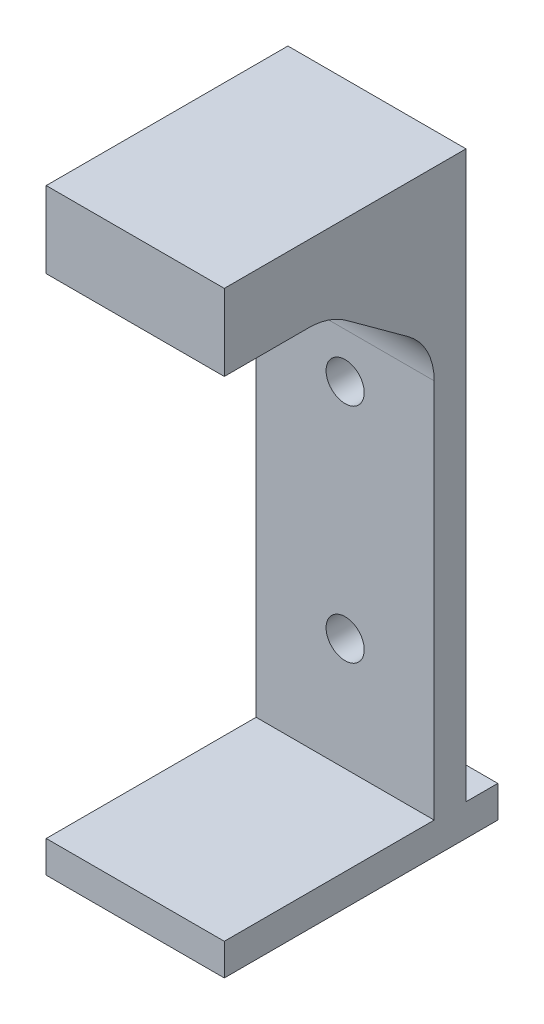
ISO-10303-21;
HEADER;
FILE_DESCRIPTION(('STEP AP214'),'2;1');
FILE_NAME('part.step','',(''),(''),'','','');
FILE_SCHEMA(('AUTOMOTIVE_DESIGN { 1 0 10303 214 1 1 1 1 }'));
ENDSEC;
DATA;
#1=APPLICATION_CONTEXT('core data for automotive mechanical design processes');
#2=APPLICATION_PROTOCOL_DEFINITION('international standard','automotive_design',2000,#1);
#3=PRODUCT_CONTEXT('',#1,'mechanical');
#4=PRODUCT('Part','Part','',(#3));
#5=PRODUCT_RELATED_PRODUCT_CATEGORY('part','',(#4));
#6=PRODUCT_DEFINITION_FORMATION('','',#4);
#7=PRODUCT_DEFINITION_CONTEXT('part definition',#1,'design');
#8=PRODUCT_DEFINITION('design','',#6,#7);
#9=PRODUCT_DEFINITION_SHAPE('','',#8);
#10=(LENGTH_UNIT() NAMED_UNIT(*) SI_UNIT(.MILLI.,.METRE.));
#11=(NAMED_UNIT(*) PLANE_ANGLE_UNIT() SI_UNIT($,.RADIAN.));
#12=(NAMED_UNIT(*) SI_UNIT($,.STERADIAN.) SOLID_ANGLE_UNIT());
#13=UNCERTAINTY_MEASURE_WITH_UNIT(LENGTH_MEASURE(1.E-05),#10,'distance_accuracy_value','');
#14=(GEOMETRIC_REPRESENTATION_CONTEXT(3) GLOBAL_UNCERTAINTY_ASSIGNED_CONTEXT((#13)) GLOBAL_UNIT_ASSIGNED_CONTEXT((#10,
#11,#12)) REPRESENTATION_CONTEXT('',''));
#15=CARTESIAN_POINT('',(0.,0.,0.));
#16=DIRECTION('',(0.,0.,1.));
#17=DIRECTION('',(1.,0.,0.));
#18=AXIS2_PLACEMENT_3D('',#15,#16,#17);
#19=CARTESIAN_POINT('',(0.,0.,2.5));
#20=DIRECTION('',(0.,0.,-1.));
#21=DIRECTION('',(-1.,0.,0.));
#22=AXIS2_PLACEMENT_3D('',#19,#20,#21);
#23=PLANE('',#22);
#24=CARTESIAN_POINT('',(7.,8.85,2.5));
#25=DIRECTION('',(0.,0.,1.));
#26=DIRECTION('',(1.,0.,0.));
#27=AXIS2_PLACEMENT_3D('',#24,#25,#26);
#28=CIRCLE('',#27,1.5);
#29=CARTESIAN_POINT('',(8.5,8.85,2.5));
#30=VERTEX_POINT('',#29);
#31=EDGE_CURVE('E235',#30,#30,#28,.T.);
#32=ORIENTED_EDGE('',*,*,#31,.F.);
#33=EDGE_LOOP('',(#32));
#34=FACE_BOUND('',#33,.T.);
#35=CARTESIAN_POINT('',(7.,26.35,2.5));
#36=DIRECTION('',(0.,0.,1.));
#37=DIRECTION('',(1.,0.,0.));
#38=AXIS2_PLACEMENT_3D('',#35,#36,#37);
#39=CIRCLE('',#38,1.5);
#40=CARTESIAN_POINT('',(8.5,26.35,2.5));
#41=VERTEX_POINT('',#40);
#42=EDGE_CURVE('E243',#41,#41,#39,.T.);
#43=ORIENTED_EDGE('',*,*,#42,.F.);
#44=EDGE_LOOP('',(#43));
#45=FACE_BOUND('',#44,.T.);
#46=DIRECTION('',(0.,1.,0.));
#47=VECTOR('',#46,1.);
#48=CARTESIAN_POINT('',(14.,0.,2.5));
#49=LINE('',#48,#47);
#50=CARTESIAN_POINT('',(14.,0.,2.5));
#51=VERTEX_POINT('',#50);
#52=CARTESIAN_POINT('',(14.,29.9038770414839,2.5));
#53=VERTEX_POINT('',#52);
#54=EDGE_CURVE('E258',#51,#53,#49,.T.);
#55=ORIENTED_EDGE('',*,*,#54,.T.);
#56=DIRECTION('',(1.,0.,0.));
#57=VECTOR('',#56,1.);
#58=CARTESIAN_POINT('',(0.,29.9038770414839,2.5));
#59=LINE('',#58,#57);
#60=CARTESIAN_POINT('',(0.,29.9038770414839,2.5));
#61=VERTEX_POINT('',#60);
#62=EDGE_CURVE('E59',#53,#61,#59,.F.);
#63=ORIENTED_EDGE('',*,*,#62,.T.);
#64=DIRECTION('',(0.,-1.,0.));
#65=VECTOR('',#64,1.);
#66=CARTESIAN_POINT('',(0.,0.,2.5));
#67=LINE('',#66,#65);
#68=CARTESIAN_POINT('',(0.,0.,2.5));
#69=VERTEX_POINT('',#68);
#70=EDGE_CURVE('E251',#61,#69,#67,.T.);
#71=ORIENTED_EDGE('',*,*,#70,.T.);
#72=DIRECTION('',(1.,0.,0.));
#73=VECTOR('',#72,1.);
#74=CARTESIAN_POINT('',(0.,0.,2.5));
#75=LINE('',#74,#73);
#76=EDGE_CURVE('E254',#69,#51,#75,.T.);
#77=ORIENTED_EDGE('',*,*,#76,.T.);
#78=EDGE_LOOP('',(#55,#63,#71,#77));
#79=FACE_BOUND('',#78,.T.);
#80=ADVANCED_FACE('F43',(#34,#45,#79),#23,.F.);
#81=CARTESIAN_POINT('',(0.,0.,0.));
#82=DIRECTION('',(0.,0.,-1.));
#83=DIRECTION('',(-1.,0.,0.));
#84=AXIS2_PLACEMENT_3D('',#81,#82,#83);
#85=PLANE('',#84);
#86=CARTESIAN_POINT('',(7.,26.35,0.));
#87=DIRECTION('',(0.,0.,1.));
#88=DIRECTION('',(1.,0.,0.));
#89=AXIS2_PLACEMENT_3D('',#86,#87,#88);
#90=CIRCLE('',#89,1.5);
#91=CARTESIAN_POINT('',(8.5,26.35,0.));
#92=VERTEX_POINT('',#91);
#93=EDGE_CURVE('E239',#92,#92,#90,.T.);
#94=ORIENTED_EDGE('',*,*,#93,.T.);
#95=EDGE_LOOP('',(#94));
#96=FACE_BOUND('',#95,.T.);
#97=DIRECTION('',(0.,-1.,0.));
#98=VECTOR('',#97,1.);
#99=CARTESIAN_POINT('',(0.,0.,0.));
#100=LINE('',#99,#98);
#101=CARTESIAN_POINT('',(0.,44.45,0.));
#102=VERTEX_POINT('',#101);
#103=CARTESIAN_POINT('',(0.,0.,0.));
#104=VERTEX_POINT('',#103);
#105=EDGE_CURVE('E247',#102,#104,#100,.T.);
#106=ORIENTED_EDGE('',*,*,#105,.F.);
#107=DIRECTION('',(-1.,0.,0.));
#108=VECTOR('',#107,1.);
#109=CARTESIAN_POINT('',(0.,44.45,0.));
#110=LINE('',#109,#108);
#111=CARTESIAN_POINT('',(14.,44.45,0.));
#112=VERTEX_POINT('',#111);
#113=EDGE_CURVE('E150',#112,#102,#110,.T.);
#114=ORIENTED_EDGE('',*,*,#113,.F.);
#115=DIRECTION('',(0.,1.,0.));
#116=VECTOR('',#115,1.);
#117=CARTESIAN_POINT('',(14.,0.,0.));
#118=LINE('',#117,#116);
#119=CARTESIAN_POINT('',(14.,0.,0.));
#120=VERTEX_POINT('',#119);
#121=EDGE_CURVE('E145',#120,#112,#118,.T.);
#122=ORIENTED_EDGE('',*,*,#121,.F.);
#123=DIRECTION('',(1.,0.,0.));
#124=VECTOR('',#123,1.);
#125=CARTESIAN_POINT('',(0.,0.,0.));
#126=LINE('',#125,#124);
#127=EDGE_CURVE('E265',#104,#120,#126,.T.);
#128=ORIENTED_EDGE('',*,*,#127,.F.);
#129=EDGE_LOOP('',(#106,#114,#122,#128));
#130=FACE_BOUND('',#129,.T.);
#131=CARTESIAN_POINT('',(7.,8.85,0.));
#132=DIRECTION('',(0.,0.,1.));
#133=DIRECTION('',(1.,0.,0.));
#134=AXIS2_PLACEMENT_3D('',#131,#132,#133);
#135=CIRCLE('',#134,1.5);
#136=CARTESIAN_POINT('',(8.5,8.85,0.));
#137=VERTEX_POINT('',#136);
#138=EDGE_CURVE('E230',#137,#137,#135,.T.);
#139=ORIENTED_EDGE('',*,*,#138,.T.);
#140=EDGE_LOOP('',(#139));
#141=FACE_BOUND('',#140,.T.);
#142=ADVANCED_FACE('F315',(#96,#130,#141),#85,.T.);
#143=CARTESIAN_POINT('',(0.,0.,2.5));
#144=DIRECTION('',(1.,0.,0.));
#145=DIRECTION('',(0.,0.,-1.));
#146=AXIS2_PLACEMENT_3D('',#143,#144,#145);
#147=PLANE('',#146);
#148=ORIENTED_EDGE('',*,*,#70,.F.);
#149=CARTESIAN_POINT('',(0.,29.9038770414839,7.5));
#150=DIRECTION('',(1.,0.,0.));
#151=DIRECTION('',(0.,0.,-1.));
#152=AXIS2_PLACEMENT_3D('',#149,#150,#151);
#153=CIRCLE('',#152,5.);
#154=CARTESIAN_POINT('',(0.,33.9475574629998,4.55914151162477));
#155=VERTEX_POINT('',#154);
#156=EDGE_CURVE('E11',#61,#155,#153,.T.);
#157=ORIENTED_EDGE('',*,*,#156,.T.);
#158=DIRECTION('',(0.,0.588171697675046,0.808736084303189));
#159=VECTOR('',#158,1.);
#160=CARTESIAN_POINT('',(0.,38.45,10.75));
#161=LINE('',#160,#159);
#162=CARTESIAN_POINT('',(0.,37.4936804215159,9.43506057958442));
#163=VERTEX_POINT('',#162);
#164=EDGE_CURVE('E186',#155,#163,#161,.T.);
#165=ORIENTED_EDGE('',*,*,#164,.T.);
#166=CARTESIAN_POINT('',(0.,33.45,12.3759190679597));
#167=DIRECTION('',(1.,0.,0.));
#168=DIRECTION('',(0.,0.,-1.));
#169=AXIS2_PLACEMENT_3D('',#166,#167,#168);
#170=CIRCLE('',#169,5.);
#171=CARTESIAN_POINT('',(0.,38.45,12.3759190679597));
#172=VERTEX_POINT('',#171);
#173=EDGE_CURVE('E285',#163,#172,#170,.T.);
#174=ORIENTED_EDGE('',*,*,#173,.T.);
#175=DIRECTION('',(0.,0.,-1.));
#176=VECTOR('',#175,1.);
#177=CARTESIAN_POINT('',(0.,38.45,34.2315462117278));
#178=LINE('',#177,#176);
#179=CARTESIAN_POINT('',(0.,38.45,19.));
#180=VERTEX_POINT('',#179);
#181=EDGE_CURVE('E182',#180,#172,#178,.T.);
#182=ORIENTED_EDGE('',*,*,#181,.F.);
#183=DIRECTION('',(0.,-1.,0.));
#184=VECTOR('',#183,1.);
#185=CARTESIAN_POINT('',(0.,44.45,19.));
#186=LINE('',#185,#184);
#187=CARTESIAN_POINT('',(0.,44.45,19.));
#188=VERTEX_POINT('',#187);
#189=EDGE_CURVE('E161',#188,#180,#186,.T.);
#190=ORIENTED_EDGE('',*,*,#189,.F.);
#191=DIRECTION('',(0.,0.,1.));
#192=VECTOR('',#191,1.);
#193=CARTESIAN_POINT('',(0.,44.45,0.));
#194=LINE('',#193,#192);
#195=EDGE_CURVE('E151',#102,#188,#194,.T.);
#196=ORIENTED_EDGE('',*,*,#195,.F.);
#197=ORIENTED_EDGE('',*,*,#105,.T.);
#198=DIRECTION('',(0.,0.,1.));
#199=VECTOR('',#198,1.);
#200=CARTESIAN_POINT('',(0.,0.,-2.5));
#201=LINE('',#200,#199);
#202=CARTESIAN_POINT('',(0.,0.,-2.5));
#203=VERTEX_POINT('',#202);
#204=EDGE_CURVE('E227',#203,#104,#201,.T.);
#205=ORIENTED_EDGE('',*,*,#204,.F.);
#206=DIRECTION('',(0.,-1.,0.));
#207=VECTOR('',#206,1.);
#208=CARTESIAN_POINT('',(0.,0.,-2.5));
#209=LINE('',#208,#207);
#210=CARTESIAN_POINT('',(0.,-2.5,-2.5));
#211=VERTEX_POINT('',#210);
#212=EDGE_CURVE('E215',#203,#211,#209,.T.);
#213=ORIENTED_EDGE('',*,*,#212,.T.);
#214=DIRECTION('',(0.,0.,1.));
#215=VECTOR('',#214,1.);
#216=CARTESIAN_POINT('',(0.,-2.5,-16.7214626533279));
#217=LINE('',#216,#215);
#218=CARTESIAN_POINT('',(0.,-2.5,19.));
#219=VERTEX_POINT('',#218);
#220=EDGE_CURVE('E173',#211,#219,#217,.T.);
#221=ORIENTED_EDGE('',*,*,#220,.T.);
#222=DIRECTION('',(0.,-1.,0.));
#223=VECTOR('',#222,1.);
#224=CARTESIAN_POINT('',(0.,0.,19.));
#225=LINE('',#224,#223);
#226=CARTESIAN_POINT('',(0.,0.,19.));
#227=VERTEX_POINT('',#226);
#228=EDGE_CURVE('E204',#227,#219,#225,.T.);
#229=ORIENTED_EDGE('',*,*,#228,.F.);
#230=EDGE_CURVE('E231',#69,#227,#201,.T.);
#231=ORIENTED_EDGE('',*,*,#230,.F.);
#232=EDGE_LOOP('',(#148,#157,#165,#174,#182,#190,#196,#197,#205,#213,#221,#229,#231));
#233=FACE_BOUND('',#232,.T.);
#234=ADVANCED_FACE('F301',(#233),#147,.F.);
#235=CARTESIAN_POINT('',(14.,0.,2.5));
#236=DIRECTION('',(-1.,0.,0.));
#237=DIRECTION('',(0.,0.,1.));
#238=AXIS2_PLACEMENT_3D('',#235,#236,#237);
#239=PLANE('',#238);
#240=DIRECTION('',(0.,0.,-1.));
#241=VECTOR('',#240,1.);
#242=CARTESIAN_POINT('',(14.,38.45,34.2315462117278));
#243=LINE('',#242,#241);
#244=CARTESIAN_POINT('',(14.,38.45,19.));
#245=VERTEX_POINT('',#244);
#246=CARTESIAN_POINT('',(14.,38.45,12.3759190679597));
#247=VERTEX_POINT('',#246);
#248=EDGE_CURVE('E162',#245,#247,#243,.T.);
#249=ORIENTED_EDGE('',*,*,#248,.T.);
#250=CARTESIAN_POINT('',(14.,33.45,12.3759190679597));
#251=DIRECTION('',(-1.,0.,0.));
#252=DIRECTION('',(0.,0.,1.));
#253=AXIS2_PLACEMENT_3D('',#250,#251,#252);
#254=CIRCLE('',#253,5.);
#255=CARTESIAN_POINT('',(14.,37.4936804215159,9.43506057958442));
#256=VERTEX_POINT('',#255);
#257=EDGE_CURVE('E282',#247,#256,#254,.T.);
#258=ORIENTED_EDGE('',*,*,#257,.T.);
#259=DIRECTION('',(0.,-0.588171697675046,-0.808736084303189));
#260=VECTOR('',#259,1.);
#261=CARTESIAN_POINT('',(14.,38.45,10.75));
#262=LINE('',#261,#260);
#263=CARTESIAN_POINT('',(14.,33.9475574629998,4.55914151162477));
#264=VERTEX_POINT('',#263);
#265=EDGE_CURVE('E177',#256,#264,#262,.T.);
#266=ORIENTED_EDGE('',*,*,#265,.T.);
#267=CARTESIAN_POINT('',(14.,29.9038770414839,7.5));
#268=DIRECTION('',(-1.,0.,0.));
#269=DIRECTION('',(0.,0.,1.));
#270=AXIS2_PLACEMENT_3D('',#267,#268,#269);
#271=CIRCLE('',#270,5.);
#272=EDGE_CURVE('E52',#264,#53,#271,.T.);
#273=ORIENTED_EDGE('',*,*,#272,.T.);
#274=ORIENTED_EDGE('',*,*,#54,.F.);
#275=DIRECTION('',(0.,0.,1.));
#276=VECTOR('',#275,1.);
#277=CARTESIAN_POINT('',(14.,0.,-2.5));
#278=LINE('',#277,#276);
#279=CARTESIAN_POINT('',(14.,0.,19.));
#280=VERTEX_POINT('',#279);
#281=EDGE_CURVE('E226',#51,#280,#278,.T.);
#282=ORIENTED_EDGE('',*,*,#281,.T.);
#283=DIRECTION('',(0.,1.,0.));
#284=VECTOR('',#283,1.);
#285=CARTESIAN_POINT('',(14.,0.,19.));
#286=LINE('',#285,#284);
#287=CARTESIAN_POINT('',(14.,-2.5,19.));
#288=VERTEX_POINT('',#287);
#289=EDGE_CURVE('E207',#288,#280,#286,.T.);
#290=ORIENTED_EDGE('',*,*,#289,.F.);
#291=DIRECTION('',(0.,0.,1.));
#292=VECTOR('',#291,1.);
#293=CARTESIAN_POINT('',(14.,-2.5,-16.7214626533279));
#294=LINE('',#293,#292);
#295=CARTESIAN_POINT('',(14.,-2.5,-2.5));
#296=VERTEX_POINT('',#295);
#297=EDGE_CURVE('E189',#296,#288,#294,.T.);
#298=ORIENTED_EDGE('',*,*,#297,.F.);
#299=DIRECTION('',(0.,1.,0.));
#300=VECTOR('',#299,1.);
#301=CARTESIAN_POINT('',(14.,0.,-2.5));
#302=LINE('',#301,#300);
#303=CARTESIAN_POINT('',(14.,0.,-2.5));
#304=VERTEX_POINT('',#303);
#305=EDGE_CURVE('E218',#296,#304,#302,.T.);
#306=ORIENTED_EDGE('',*,*,#305,.T.);
#307=EDGE_CURVE('E232',#304,#120,#278,.T.);
#308=ORIENTED_EDGE('',*,*,#307,.T.);
#309=ORIENTED_EDGE('',*,*,#121,.T.);
#310=DIRECTION('',(0.,0.,-1.));
#311=VECTOR('',#310,1.);
#312=CARTESIAN_POINT('',(14.,44.45,0.));
#313=LINE('',#312,#311);
#314=CARTESIAN_POINT('',(14.,44.45,19.));
#315=VERTEX_POINT('',#314);
#316=EDGE_CURVE('E136',#315,#112,#313,.T.);
#317=ORIENTED_EDGE('',*,*,#316,.F.);
#318=DIRECTION('',(0.,1.,0.));
#319=VECTOR('',#318,1.);
#320=CARTESIAN_POINT('',(14.,44.45,19.));
#321=LINE('',#320,#319);
#322=EDGE_CURVE('E141',#245,#315,#321,.T.);
#323=ORIENTED_EDGE('',*,*,#322,.F.);
#324=EDGE_LOOP('',(#249,#258,#266,#273,#274,#282,#290,#298,#306,#308,#309,#317,#323));
#325=FACE_BOUND('',#324,.T.);
#326=ADVANCED_FACE('F139',(#325),#239,.F.);
#327=CARTESIAN_POINT('',(7.,26.35,2.5));
#328=DIRECTION('',(0.,0.,-1.));
#329=DIRECTION('',(-1.,0.,0.));
#330=AXIS2_PLACEMENT_3D('',#327,#328,#329);
#331=CYLINDRICAL_SURFACE('',#330,1.5);
#332=ORIENTED_EDGE('',*,*,#42,.T.);
#333=EDGE_LOOP('',(#332));
#334=FACE_BOUND('',#333,.T.);
#335=ORIENTED_EDGE('',*,*,#93,.F.);
#336=EDGE_LOOP('',(#335));
#337=FACE_BOUND('',#336,.T.);
#338=ADVANCED_FACE('F349',(#334,#337),#331,.F.);
#339=CARTESIAN_POINT('',(7.,8.85,2.5));
#340=DIRECTION('',(0.,0.,-1.));
#341=DIRECTION('',(-1.,0.,0.));
#342=AXIS2_PLACEMENT_3D('',#339,#340,#341);
#343=CYLINDRICAL_SURFACE('',#342,1.5);
#344=ORIENTED_EDGE('',*,*,#31,.T.);
#345=EDGE_LOOP('',(#344));
#346=FACE_BOUND('',#345,.T.);
#347=ORIENTED_EDGE('',*,*,#138,.F.);
#348=EDGE_LOOP('',(#347));
#349=FACE_BOUND('',#348,.T.);
#350=ADVANCED_FACE('F370',(#346,#349),#343,.F.);
#351=CARTESIAN_POINT('',(0.,0.,-2.5));
#352=DIRECTION('',(0.,1.,0.));
#353=DIRECTION('',(0.,0.,1.));
#354=AXIS2_PLACEMENT_3D('',#351,#352,#353);
#355=PLANE('',#354);
#356=ORIENTED_EDGE('',*,*,#76,.F.);
#357=ORIENTED_EDGE('',*,*,#230,.T.);
#358=DIRECTION('',(-1.,0.,0.));
#359=VECTOR('',#358,1.);
#360=CARTESIAN_POINT('',(0.,0.,19.));
#361=LINE('',#360,#359);
#362=EDGE_CURVE('E211',#280,#227,#361,.T.);
#363=ORIENTED_EDGE('',*,*,#362,.F.);
#364=ORIENTED_EDGE('',*,*,#281,.F.);
#365=EDGE_LOOP('',(#356,#357,#363,#364));
#366=FACE_BOUND('',#365,.T.);
#367=ADVANCED_FACE('F298',(#366),#355,.T.);
#368=ORIENTED_EDGE('',*,*,#204,.T.);
#369=ORIENTED_EDGE('',*,*,#127,.T.);
#370=ORIENTED_EDGE('',*,*,#307,.F.);
#371=DIRECTION('',(-1.,0.,0.));
#372=VECTOR('',#371,1.);
#373=CARTESIAN_POINT('',(0.,0.,-2.5));
#374=LINE('',#373,#372);
#375=EDGE_CURVE('E222',#304,#203,#374,.T.);
#376=ORIENTED_EDGE('',*,*,#375,.T.);
#377=EDGE_LOOP('',(#368,#369,#370,#376));
#378=FACE_BOUND('',#377,.T.);
#379=ADVANCED_FACE('F312',(#378),#355,.T.);
#380=CARTESIAN_POINT('',(0.,0.,-2.5));
#381=DIRECTION('',(0.,0.,1.));
#382=DIRECTION('',(1.,0.,0.));
#383=AXIS2_PLACEMENT_3D('',#380,#381,#382);
#384=PLANE('',#383);
#385=ORIENTED_EDGE('',*,*,#212,.F.);
#386=ORIENTED_EDGE('',*,*,#375,.F.);
#387=ORIENTED_EDGE('',*,*,#305,.F.);
#388=DIRECTION('',(-1.,0.,0.));
#389=VECTOR('',#388,1.);
#390=CARTESIAN_POINT('',(0.,-2.5,-2.5));
#391=LINE('',#390,#389);
#392=EDGE_CURVE('E193',#296,#211,#391,.T.);
#393=ORIENTED_EDGE('',*,*,#392,.T.);
#394=EDGE_LOOP('',(#385,#386,#387,#393));
#395=FACE_BOUND('',#394,.T.);
#396=ADVANCED_FACE('F310',(#395),#384,.F.);
#397=CARTESIAN_POINT('',(0.,0.,19.));
#398=DIRECTION('',(0.,0.,1.));
#399=DIRECTION('',(1.,0.,0.));
#400=AXIS2_PLACEMENT_3D('',#397,#398,#399);
#401=PLANE('',#400);
#402=ORIENTED_EDGE('',*,*,#228,.T.);
#403=DIRECTION('',(1.,0.,0.));
#404=VECTOR('',#403,1.);
#405=CARTESIAN_POINT('',(0.,-2.5,19.));
#406=LINE('',#405,#404);
#407=EDGE_CURVE('E168',#219,#288,#406,.T.);
#408=ORIENTED_EDGE('',*,*,#407,.T.);
#409=ORIENTED_EDGE('',*,*,#289,.T.);
#410=ORIENTED_EDGE('',*,*,#362,.T.);
#411=EDGE_LOOP('',(#402,#408,#409,#410));
#412=FACE_BOUND('',#411,.T.);
#413=ADVANCED_FACE('F295',(#412),#401,.T.);
#414=CARTESIAN_POINT('',(0.,44.45,0.));
#415=DIRECTION('',(0.,1.,0.));
#416=DIRECTION('',(0.,0.,1.));
#417=AXIS2_PLACEMENT_3D('',#414,#415,#416);
#418=PLANE('',#417);
#419=ORIENTED_EDGE('',*,*,#195,.T.);
#420=DIRECTION('',(-1.,0.,0.));
#421=VECTOR('',#420,1.);
#422=CARTESIAN_POINT('',(0.,44.45,19.));
#423=LINE('',#422,#421);
#424=EDGE_CURVE('E154',#315,#188,#423,.T.);
#425=ORIENTED_EDGE('',*,*,#424,.F.);
#426=ORIENTED_EDGE('',*,*,#316,.T.);
#427=ORIENTED_EDGE('',*,*,#113,.T.);
#428=EDGE_LOOP('',(#419,#425,#426,#427));
#429=FACE_BOUND('',#428,.T.);
#430=ADVANCED_FACE('F155',(#429),#418,.T.);
#431=CARTESIAN_POINT('',(0.,-2.5,-16.7214626533279));
#432=DIRECTION('',(0.,-1.,0.));
#433=DIRECTION('',(0.,0.,-1.));
#434=AXIS2_PLACEMENT_3D('',#431,#432,#433);
#435=PLANE('',#434);
#436=ORIENTED_EDGE('',*,*,#392,.F.);
#437=ORIENTED_EDGE('',*,*,#297,.T.);
#438=ORIENTED_EDGE('',*,*,#407,.F.);
#439=ORIENTED_EDGE('',*,*,#220,.F.);
#440=EDGE_LOOP('',(#436,#437,#438,#439));
#441=FACE_BOUND('',#440,.T.);
#442=ADVANCED_FACE('F307',(#441),#435,.T.);
#443=CARTESIAN_POINT('',(0.,38.45,34.2315462117278));
#444=DIRECTION('',(0.,1.,0.));
#445=DIRECTION('',(0.,0.,1.));
#446=AXIS2_PLACEMENT_3D('',#443,#444,#445);
#447=PLANE('',#446);
#448=ORIENTED_EDGE('',*,*,#181,.T.);
#449=DIRECTION('',(1.,0.,0.));
#450=VECTOR('',#449,1.);
#451=CARTESIAN_POINT('',(0.,38.45,12.3759190679597));
#452=LINE('',#451,#450);
#453=EDGE_CURVE('E261',#172,#247,#452,.T.);
#454=ORIENTED_EDGE('',*,*,#453,.T.);
#455=ORIENTED_EDGE('',*,*,#248,.F.);
#456=DIRECTION('',(1.,0.,0.));
#457=VECTOR('',#456,1.);
#458=CARTESIAN_POINT('',(0.,38.45,19.));
#459=LINE('',#458,#457);
#460=EDGE_CURVE('E166',#180,#245,#459,.T.);
#461=ORIENTED_EDGE('',*,*,#460,.F.);
#462=EDGE_LOOP('',(#448,#454,#455,#461));
#463=FACE_BOUND('',#462,.T.);
#464=ADVANCED_FACE('F322',(#463),#447,.F.);
#465=CARTESIAN_POINT('',(0.,0.,19.));
#466=DIRECTION('',(0.,0.,1.));
#467=DIRECTION('',(1.,0.,0.));
#468=AXIS2_PLACEMENT_3D('',#465,#466,#467);
#469=PLANE('',#468);
#470=ORIENTED_EDGE('',*,*,#424,.T.);
#471=ORIENTED_EDGE('',*,*,#189,.T.);
#472=ORIENTED_EDGE('',*,*,#460,.T.);
#473=ORIENTED_EDGE('',*,*,#322,.T.);
#474=EDGE_LOOP('',(#470,#471,#472,#473));
#475=FACE_BOUND('',#474,.T.);
#476=ADVANCED_FACE('F165',(#475),#469,.T.);
#477=CARTESIAN_POINT('',(-10.2011028815516,38.45,10.75));
#478=DIRECTION('',(0.,-0.808736084303189,0.588171697675046));
#479=DIRECTION('',(0.,-0.588171697675046,-0.808736084303189));
#480=AXIS2_PLACEMENT_3D('',#477,#478,#479);
#481=PLANE('',#480);
#482=ORIENTED_EDGE('',*,*,#265,.F.);
#483=DIRECTION('',(1.,0.,0.));
#484=VECTOR('',#483,1.);
#485=CARTESIAN_POINT('',(-10.2011028815516,37.4936804215159,9.43506057958442));
#486=LINE('',#485,#484);
#487=EDGE_CURVE('E277',#256,#163,#486,.F.);
#488=ORIENTED_EDGE('',*,*,#487,.T.);
#489=ORIENTED_EDGE('',*,*,#164,.F.);
#490=DIRECTION('',(1.,0.,0.));
#491=VECTOR('',#490,1.);
#492=CARTESIAN_POINT('',(-10.2011028815516,33.9475574629998,4.55914151162477));
#493=LINE('',#492,#491);
#494=EDGE_CURVE('E273',#155,#264,#493,.T.);
#495=ORIENTED_EDGE('',*,*,#494,.T.);
#496=EDGE_LOOP('',(#482,#488,#489,#495));
#497=FACE_BOUND('',#496,.T.);
#498=ADVANCED_FACE('F328',(#497),#481,.T.);
#499=CARTESIAN_POINT('',(0.,33.45,12.3759190679597));
#500=DIRECTION('',(1.,0.,0.));
#501=DIRECTION('',(0.,0.,-1.));
#502=AXIS2_PLACEMENT_3D('',#499,#500,#501);
#503=CYLINDRICAL_SURFACE('',#502,5.);
#504=ORIENTED_EDGE('',*,*,#173,.F.);
#505=ORIENTED_EDGE('',*,*,#487,.F.);
#506=ORIENTED_EDGE('',*,*,#257,.F.);
#507=ORIENTED_EDGE('',*,*,#453,.F.);
#508=EDGE_LOOP('',(#504,#505,#506,#507));
#509=FACE_BOUND('',#508,.T.);
#510=ADVANCED_FACE('F324',(#509),#503,.F.);
#511=CARTESIAN_POINT('',(-10.2011028815516,29.9038770414839,7.5));
#512=DIRECTION('',(1.,0.,0.));
#513=DIRECTION('',(0.,0.,-1.));
#514=AXIS2_PLACEMENT_3D('',#511,#512,#513);
#515=CYLINDRICAL_SURFACE('',#514,5.);
#516=ORIENTED_EDGE('',*,*,#156,.F.);
#517=ORIENTED_EDGE('',*,*,#62,.F.);
#518=ORIENTED_EDGE('',*,*,#272,.F.);
#519=ORIENTED_EDGE('',*,*,#494,.F.);
#520=EDGE_LOOP('',(#516,#517,#518,#519));
#521=FACE_BOUND('',#520,.T.);
#522=ADVANCED_FACE('F45',(#521),#515,.F.);
#523=CLOSED_SHELL('',(#80,#142,#234,#326,#338,#350,#367,#379,#396,#413,#430,#442,#464,#476,#498,
#510,#522));
#524=MANIFOLD_SOLID_BREP('B2',#523);
#525=ADVANCED_BREP_SHAPE_REPRESENTATION('',(#18,#524),#14);
#526=SHAPE_DEFINITION_REPRESENTATION(#9,#525);
ENDSEC;
END-ISO-10303-21;
